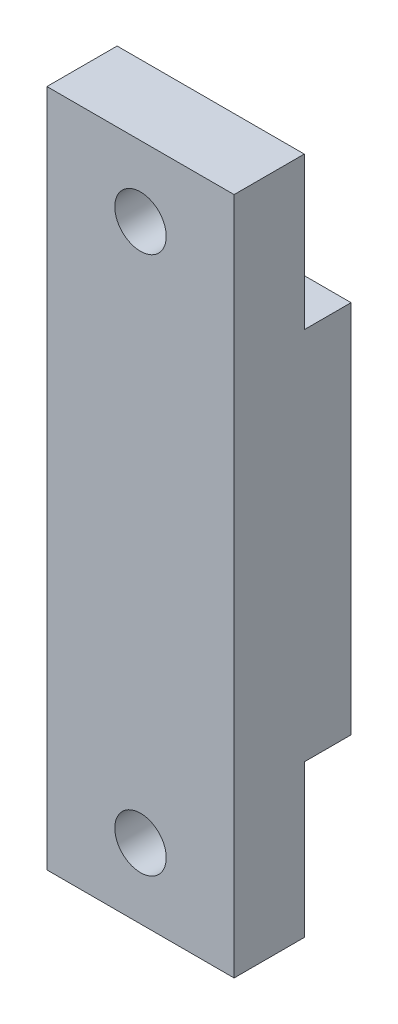
ISO-10303-21;
HEADER;
FILE_DESCRIPTION(('STEP AP214'),'2;1');
FILE_NAME('part.step','',(''),(''),'','','');
FILE_SCHEMA(('AUTOMOTIVE_DESIGN { 1 0 10303 214 1 1 1 1 }'));
ENDSEC;
DATA;
#1=APPLICATION_CONTEXT('core data for automotive mechanical design processes');
#2=APPLICATION_PROTOCOL_DEFINITION('international standard','automotive_design',2000,#1);
#3=PRODUCT_CONTEXT('',#1,'mechanical');
#4=PRODUCT('Part','Part','',(#3));
#5=PRODUCT_RELATED_PRODUCT_CATEGORY('part','',(#4));
#6=PRODUCT_DEFINITION_FORMATION('','',#4);
#7=PRODUCT_DEFINITION_CONTEXT('part definition',#1,'design');
#8=PRODUCT_DEFINITION('design','',#6,#7);
#9=PRODUCT_DEFINITION_SHAPE('','',#8);
#10=(LENGTH_UNIT() NAMED_UNIT(*) SI_UNIT(.MILLI.,.METRE.));
#11=(NAMED_UNIT(*) PLANE_ANGLE_UNIT() SI_UNIT($,.RADIAN.));
#12=(NAMED_UNIT(*) SI_UNIT($,.STERADIAN.) SOLID_ANGLE_UNIT());
#13=UNCERTAINTY_MEASURE_WITH_UNIT(LENGTH_MEASURE(1.E-05),#10,'distance_accuracy_value','');
#14=(GEOMETRIC_REPRESENTATION_CONTEXT(3) GLOBAL_UNCERTAINTY_ASSIGNED_CONTEXT((#13)) GLOBAL_UNIT_ASSIGNED_CONTEXT((#10,
#11,#12)) REPRESENTATION_CONTEXT('',''));
#15=CARTESIAN_POINT('',(0.,0.,0.));
#16=DIRECTION('',(0.,0.,1.));
#17=DIRECTION('',(1.,0.,0.));
#18=AXIS2_PLACEMENT_3D('',#15,#16,#17);
#19=CARTESIAN_POINT('',(0.,0.,0.));
#20=DIRECTION('',(0.,0.,1.));
#21=DIRECTION('',(1.,0.,0.));
#22=AXIS2_PLACEMENT_3D('',#19,#20,#21);
#23=PLANE('',#22);
#24=CARTESIAN_POINT('',(0.,-11.5,0.));
#25=DIRECTION('',(0.,0.,1.));
#26=DIRECTION('',(1.,0.,0.));
#27=AXIS2_PLACEMENT_3D('',#24,#25,#26);
#28=CIRCLE('',#27,1.1);
#29=CARTESIAN_POINT('',(1.1,-11.5,0.));
#30=VERTEX_POINT('',#29);
#31=EDGE_CURVE('E134',#30,#30,#28,.F.);
#32=ORIENTED_EDGE('',*,*,#31,.F.);
#33=EDGE_LOOP('',(#32));
#34=FACE_BOUND('',#33,.T.);
#35=DIRECTION('',(0.,-1.,0.));
#36=VECTOR('',#35,1.);
#37=CARTESIAN_POINT('',(-4.,14.5,0.));
#38=LINE('',#37,#36);
#39=CARTESIAN_POINT('',(-4.,-8.,0.));
#40=VERTEX_POINT('',#39);
#41=CARTESIAN_POINT('',(-4.,-14.5,0.));
#42=VERTEX_POINT('',#41);
#43=EDGE_CURVE('E158',#40,#42,#38,.T.);
#44=ORIENTED_EDGE('',*,*,#43,.F.);
#45=DIRECTION('',(1.,0.,0.));
#46=VECTOR('',#45,1.);
#47=CARTESIAN_POINT('',(4.,-8.,0.));
#48=LINE('',#47,#46);
#49=CARTESIAN_POINT('',(4.,-8.,0.));
#50=VERTEX_POINT('',#49);
#51=EDGE_CURVE('E112',#40,#50,#48,.T.);
#52=ORIENTED_EDGE('',*,*,#51,.T.);
#53=DIRECTION('',(0.,1.,0.));
#54=VECTOR('',#53,1.);
#55=CARTESIAN_POINT('',(4.,14.5,0.));
#56=LINE('',#55,#54);
#57=CARTESIAN_POINT('',(4.,-14.5,0.));
#58=VERTEX_POINT('',#57);
#59=EDGE_CURVE('E153',#58,#50,#56,.T.);
#60=ORIENTED_EDGE('',*,*,#59,.F.);
#61=DIRECTION('',(1.,0.,0.));
#62=VECTOR('',#61,1.);
#63=CARTESIAN_POINT('',(-4.,-14.5,0.));
#64=LINE('',#63,#62);
#65=EDGE_CURVE('E77',#42,#58,#64,.T.);
#66=ORIENTED_EDGE('',*,*,#65,.F.);
#67=EDGE_LOOP('',(#44,#52,#60,#66));
#68=FACE_BOUND('',#67,.T.);
#69=ADVANCED_FACE('F32',(#34,#68),#23,.F.);
#70=CARTESIAN_POINT('',(4.,14.5,3.));
#71=DIRECTION('',(-1.,0.,0.));
#72=DIRECTION('',(0.,-1.,0.));
#73=AXIS2_PLACEMENT_3D('',#70,#71,#72);
#74=PLANE('',#73);
#75=ORIENTED_EDGE('',*,*,#59,.T.);
#76=DIRECTION('',(0.,0.,1.));
#77=VECTOR('',#76,1.);
#78=CARTESIAN_POINT('',(4.,-8.,-2.));
#79=LINE('',#78,#77);
#80=CARTESIAN_POINT('',(4.,-8.,-2.));
#81=VERTEX_POINT('',#80);
#82=EDGE_CURVE('E116',#81,#50,#79,.T.);
#83=ORIENTED_EDGE('',*,*,#82,.F.);
#84=DIRECTION('',(0.,1.,0.));
#85=VECTOR('',#84,1.);
#86=CARTESIAN_POINT('',(4.,8.,-2.));
#87=LINE('',#86,#85);
#88=CARTESIAN_POINT('',(4.,8.,-2.));
#89=VERTEX_POINT('',#88);
#90=EDGE_CURVE('E126',#81,#89,#87,.T.);
#91=ORIENTED_EDGE('',*,*,#90,.T.);
#92=DIRECTION('',(0.,0.,1.));
#93=VECTOR('',#92,1.);
#94=CARTESIAN_POINT('',(4.,8.,-2.));
#95=LINE('',#94,#93);
#96=CARTESIAN_POINT('',(4.,8.,0.));
#97=VERTEX_POINT('',#96);
#98=EDGE_CURVE('E143',#89,#97,#95,.T.);
#99=ORIENTED_EDGE('',*,*,#98,.T.);
#100=CARTESIAN_POINT('',(4.,14.5,0.));
#101=VERTEX_POINT('',#100);
#102=EDGE_CURVE('E142',#97,#101,#56,.T.);
#103=ORIENTED_EDGE('',*,*,#102,.T.);
#104=DIRECTION('',(0.,0.,-1.));
#105=VECTOR('',#104,1.);
#106=CARTESIAN_POINT('',(4.,14.5,3.));
#107=LINE('',#106,#105);
#108=CARTESIAN_POINT('',(4.,14.5,3.));
#109=VERTEX_POINT('',#108);
#110=EDGE_CURVE('E11',#109,#101,#107,.T.);
#111=ORIENTED_EDGE('',*,*,#110,.F.);
#112=DIRECTION('',(0.,1.,0.));
#113=VECTOR('',#112,1.);
#114=CARTESIAN_POINT('',(4.,14.5,3.));
#115=LINE('',#114,#113);
#116=CARTESIAN_POINT('',(4.,-14.5,3.));
#117=VERTEX_POINT('',#116);
#118=EDGE_CURVE('E146',#117,#109,#115,.T.);
#119=ORIENTED_EDGE('',*,*,#118,.F.);
#120=DIRECTION('',(0.,0.,-1.));
#121=VECTOR('',#120,1.);
#122=CARTESIAN_POINT('',(4.,-14.5,3.));
#123=LINE('',#122,#121);
#124=EDGE_CURVE('E152',#117,#58,#123,.T.);
#125=ORIENTED_EDGE('',*,*,#124,.T.);
#126=EDGE_LOOP('',(#75,#83,#91,#99,#103,#111,#119,#125));
#127=FACE_BOUND('',#126,.T.);
#128=ADVANCED_FACE('F34',(#127),#74,.F.);
#129=CARTESIAN_POINT('',(-4.,14.5,3.));
#130=DIRECTION('',(0.,-1.,0.));
#131=DIRECTION('',(0.,0.,-1.));
#132=AXIS2_PLACEMENT_3D('',#129,#130,#131);
#133=PLANE('',#132);
#134=DIRECTION('',(-1.,0.,0.));
#135=VECTOR('',#134,1.);
#136=CARTESIAN_POINT('',(-4.,14.5,0.));
#137=LINE('',#136,#135);
#138=CARTESIAN_POINT('',(-4.,14.5,0.));
#139=VERTEX_POINT('',#138);
#140=EDGE_CURVE('E156',#101,#139,#137,.T.);
#141=ORIENTED_EDGE('',*,*,#140,.T.);
#142=DIRECTION('',(0.,0.,-1.));
#143=VECTOR('',#142,1.);
#144=CARTESIAN_POINT('',(-4.,14.5,3.));
#145=LINE('',#144,#143);
#146=CARTESIAN_POINT('',(-4.,14.5,3.));
#147=VERTEX_POINT('',#146);
#148=EDGE_CURVE('E40',#147,#139,#145,.T.);
#149=ORIENTED_EDGE('',*,*,#148,.F.);
#150=DIRECTION('',(-1.,0.,0.));
#151=VECTOR('',#150,1.);
#152=CARTESIAN_POINT('',(-4.,14.5,3.));
#153=LINE('',#152,#151);
#154=EDGE_CURVE('E84',#109,#147,#153,.T.);
#155=ORIENTED_EDGE('',*,*,#154,.F.);
#156=ORIENTED_EDGE('',*,*,#110,.T.);
#157=EDGE_LOOP('',(#141,#149,#155,#156));
#158=FACE_BOUND('',#157,.T.);
#159=ADVANCED_FACE('F198',(#158),#133,.F.);
#160=CARTESIAN_POINT('',(-4.,14.5,3.));
#161=DIRECTION('',(1.,0.,0.));
#162=DIRECTION('',(0.,1.,0.));
#163=AXIS2_PLACEMENT_3D('',#160,#161,#162);
#164=PLANE('',#163);
#165=CARTESIAN_POINT('',(-4.,8.,0.));
#166=VERTEX_POINT('',#165);
#167=EDGE_CURVE('E159',#139,#166,#38,.T.);
#168=ORIENTED_EDGE('',*,*,#167,.T.);
#169=DIRECTION('',(0.,0.,1.));
#170=VECTOR('',#169,1.);
#171=CARTESIAN_POINT('',(-4.,8.,-2.));
#172=LINE('',#171,#170);
#173=CARTESIAN_POINT('',(-4.,8.,-2.));
#174=VERTEX_POINT('',#173);
#175=EDGE_CURVE('E47',#174,#166,#172,.T.);
#176=ORIENTED_EDGE('',*,*,#175,.F.);
#177=DIRECTION('',(0.,-1.,0.));
#178=VECTOR('',#177,1.);
#179=CARTESIAN_POINT('',(-4.,8.,-2.));
#180=LINE('',#179,#178);
#181=CARTESIAN_POINT('',(-4.,-8.,-2.));
#182=VERTEX_POINT('',#181);
#183=EDGE_CURVE('E124',#174,#182,#180,.T.);
#184=ORIENTED_EDGE('',*,*,#183,.T.);
#185=DIRECTION('',(0.,0.,1.));
#186=VECTOR('',#185,1.);
#187=CARTESIAN_POINT('',(-4.,-8.,-2.));
#188=LINE('',#187,#186);
#189=EDGE_CURVE('E107',#182,#40,#188,.T.);
#190=ORIENTED_EDGE('',*,*,#189,.T.);
#191=ORIENTED_EDGE('',*,*,#43,.T.);
#192=DIRECTION('',(0.,0.,-1.));
#193=VECTOR('',#192,1.);
#194=CARTESIAN_POINT('',(-4.,-14.5,3.));
#195=LINE('',#194,#193);
#196=CARTESIAN_POINT('',(-4.,-14.5,3.));
#197=VERTEX_POINT('',#196);
#198=EDGE_CURVE('E163',#197,#42,#195,.T.);
#199=ORIENTED_EDGE('',*,*,#198,.F.);
#200=DIRECTION('',(0.,-1.,0.));
#201=VECTOR('',#200,1.);
#202=CARTESIAN_POINT('',(-4.,14.5,3.));
#203=LINE('',#202,#201);
#204=EDGE_CURVE('E149',#147,#197,#203,.T.);
#205=ORIENTED_EDGE('',*,*,#204,.F.);
#206=ORIENTED_EDGE('',*,*,#148,.T.);
#207=EDGE_LOOP('',(#168,#176,#184,#190,#191,#199,#205,#206));
#208=FACE_BOUND('',#207,.T.);
#209=ADVANCED_FACE('F129',(#208),#164,.F.);
#210=CARTESIAN_POINT('',(-4.,-14.5,3.));
#211=DIRECTION('',(0.,1.,0.));
#212=DIRECTION('',(0.,0.,1.));
#213=AXIS2_PLACEMENT_3D('',#210,#211,#212);
#214=PLANE('',#213);
#215=ORIENTED_EDGE('',*,*,#65,.T.);
#216=ORIENTED_EDGE('',*,*,#124,.F.);
#217=DIRECTION('',(1.,0.,0.));
#218=VECTOR('',#217,1.);
#219=CARTESIAN_POINT('',(-4.,-14.5,3.));
#220=LINE('',#219,#218);
#221=EDGE_CURVE('E56',#197,#117,#220,.T.);
#222=ORIENTED_EDGE('',*,*,#221,.F.);
#223=ORIENTED_EDGE('',*,*,#198,.T.);
#224=EDGE_LOOP('',(#215,#216,#222,#223));
#225=FACE_BOUND('',#224,.T.);
#226=ADVANCED_FACE('F176',(#225),#214,.F.);
#227=CARTESIAN_POINT('',(0.,0.,3.));
#228=DIRECTION('',(0.,0.,1.));
#229=DIRECTION('',(1.,0.,0.));
#230=AXIS2_PLACEMENT_3D('',#227,#228,#229);
#231=PLANE('',#230);
#232=CARTESIAN_POINT('',(0.,11.5,3.));
#233=DIRECTION('',(0.,0.,1.));
#234=DIRECTION('',(1.,0.,0.));
#235=AXIS2_PLACEMENT_3D('',#232,#233,#234);
#236=CIRCLE('',#235,1.1);
#237=CARTESIAN_POINT('',(1.1,11.5,3.));
#238=VERTEX_POINT('',#237);
#239=EDGE_CURVE('E293',#238,#238,#236,.T.);
#240=ORIENTED_EDGE('',*,*,#239,.F.);
#241=EDGE_LOOP('',(#240));
#242=FACE_BOUND('',#241,.T.);
#243=CARTESIAN_POINT('',(0.,-11.5,3.));
#244=DIRECTION('',(0.,0.,1.));
#245=DIRECTION('',(-1.,0.,0.));
#246=AXIS2_PLACEMENT_3D('',#243,#244,#245);
#247=CIRCLE('',#246,1.1);
#248=CARTESIAN_POINT('',(-1.1,-11.5,3.));
#249=VERTEX_POINT('',#248);
#250=EDGE_CURVE('E291',#249,#249,#247,.T.);
#251=ORIENTED_EDGE('',*,*,#250,.F.);
#252=EDGE_LOOP('',(#251));
#253=FACE_BOUND('',#252,.T.);
#254=ORIENTED_EDGE('',*,*,#118,.T.);
#255=ORIENTED_EDGE('',*,*,#154,.T.);
#256=ORIENTED_EDGE('',*,*,#204,.T.);
#257=ORIENTED_EDGE('',*,*,#221,.T.);
#258=EDGE_LOOP('',(#254,#255,#256,#257));
#259=FACE_BOUND('',#258,.T.);
#260=ADVANCED_FACE('F179',(#242,#253,#259),#231,.T.);
#261=CARTESIAN_POINT('',(0.,11.5,0.));
#262=DIRECTION('',(0.,0.,1.));
#263=DIRECTION('',(1.,0.,0.));
#264=AXIS2_PLACEMENT_3D('',#261,#262,#263);
#265=CIRCLE('',#264,1.1);
#266=CARTESIAN_POINT('',(1.1,11.5,0.));
#267=VERTEX_POINT('',#266);
#268=EDGE_CURVE('E139',#267,#267,#265,.F.);
#269=ORIENTED_EDGE('',*,*,#268,.F.);
#270=EDGE_LOOP('',(#269));
#271=FACE_BOUND('',#270,.T.);
#272=ORIENTED_EDGE('',*,*,#102,.F.);
#273=DIRECTION('',(-1.,0.,0.));
#274=VECTOR('',#273,1.);
#275=CARTESIAN_POINT('',(4.,8.,0.));
#276=LINE('',#275,#274);
#277=EDGE_CURVE('E130',#97,#166,#276,.T.);
#278=ORIENTED_EDGE('',*,*,#277,.T.);
#279=ORIENTED_EDGE('',*,*,#167,.F.);
#280=ORIENTED_EDGE('',*,*,#140,.F.);
#281=EDGE_LOOP('',(#272,#278,#279,#280));
#282=FACE_BOUND('',#281,.T.);
#283=ADVANCED_FACE('F171',(#271,#282),#23,.F.);
#284=CARTESIAN_POINT('',(4.,8.,-2.));
#285=DIRECTION('',(0.,1.,0.));
#286=DIRECTION('',(0.,0.,1.));
#287=AXIS2_PLACEMENT_3D('',#284,#285,#286);
#288=PLANE('',#287);
#289=ORIENTED_EDGE('',*,*,#277,.F.);
#290=ORIENTED_EDGE('',*,*,#98,.F.);
#291=DIRECTION('',(-1.,0.,0.));
#292=VECTOR('',#291,1.);
#293=CARTESIAN_POINT('',(4.,8.,-2.));
#294=LINE('',#293,#292);
#295=EDGE_CURVE('E117',#89,#174,#294,.T.);
#296=ORIENTED_EDGE('',*,*,#295,.T.);
#297=ORIENTED_EDGE('',*,*,#175,.T.);
#298=EDGE_LOOP('',(#289,#290,#296,#297));
#299=FACE_BOUND('',#298,.T.);
#300=ADVANCED_FACE('F172',(#299),#288,.T.);
#301=CARTESIAN_POINT('',(4.,-8.,-2.));
#302=DIRECTION('',(0.,-1.,0.));
#303=DIRECTION('',(0.,0.,-1.));
#304=AXIS2_PLACEMENT_3D('',#301,#302,#303);
#305=PLANE('',#304);
#306=ORIENTED_EDGE('',*,*,#51,.F.);
#307=ORIENTED_EDGE('',*,*,#189,.F.);
#308=DIRECTION('',(1.,0.,0.));
#309=VECTOR('',#308,1.);
#310=CARTESIAN_POINT('',(4.,-8.,-2.));
#311=LINE('',#310,#309);
#312=EDGE_CURVE('E110',#182,#81,#311,.T.);
#313=ORIENTED_EDGE('',*,*,#312,.T.);
#314=ORIENTED_EDGE('',*,*,#82,.T.);
#315=EDGE_LOOP('',(#306,#307,#313,#314));
#316=FACE_BOUND('',#315,.T.);
#317=ADVANCED_FACE('F109',(#316),#305,.T.);
#318=CARTESIAN_POINT('',(0.,0.,-2.));
#319=DIRECTION('',(0.,0.,-1.));
#320=DIRECTION('',(-1.,0.,0.));
#321=AXIS2_PLACEMENT_3D('',#318,#319,#320);
#322=PLANE('',#321);
#323=ORIENTED_EDGE('',*,*,#183,.F.);
#324=ORIENTED_EDGE('',*,*,#295,.F.);
#325=ORIENTED_EDGE('',*,*,#90,.F.);
#326=ORIENTED_EDGE('',*,*,#312,.F.);
#327=EDGE_LOOP('',(#323,#324,#325,#326));
#328=FACE_BOUND('',#327,.T.);
#329=ADVANCED_FACE('F122',(#328),#322,.T.);
#330=CARTESIAN_POINT('',(0.,11.5,-2.001));
#331=DIRECTION('',(0.,0.,1.));
#332=DIRECTION('',(1.,0.,0.));
#333=AXIS2_PLACEMENT_3D('',#330,#331,#332);
#334=CYLINDRICAL_SURFACE('',#333,1.1);
#335=ORIENTED_EDGE('',*,*,#239,.T.);
#336=EDGE_LOOP('',(#335));
#337=FACE_BOUND('',#336,.T.);
#338=ORIENTED_EDGE('',*,*,#268,.T.);
#339=EDGE_LOOP('',(#338));
#340=FACE_BOUND('',#339,.T.);
#341=ADVANCED_FACE('F255',(#337,#340),#334,.F.);
#342=CARTESIAN_POINT('',(0.,-11.5,-2.001));
#343=DIRECTION('',(0.,0.,1.));
#344=DIRECTION('',(1.,0.,0.));
#345=AXIS2_PLACEMENT_3D('',#342,#343,#344);
#346=CYLINDRICAL_SURFACE('',#345,1.1);
#347=ORIENTED_EDGE('',*,*,#250,.T.);
#348=EDGE_LOOP('',(#347));
#349=FACE_BOUND('',#348,.T.);
#350=ORIENTED_EDGE('',*,*,#31,.T.);
#351=EDGE_LOOP('',(#350));
#352=FACE_BOUND('',#351,.T.);
#353=ADVANCED_FACE('F263',(#349,#352),#346,.F.);
#354=CLOSED_SHELL('',(#69,#128,#159,#209,#226,#260,#283,#300,#317,#329,#341,#353));
#355=MANIFOLD_SOLID_BREP('B2',#354);
#356=ADVANCED_BREP_SHAPE_REPRESENTATION('',(#18,#355),#14);
#357=SHAPE_DEFINITION_REPRESENTATION(#9,#356);
ENDSEC;
END-ISO-10303-21;
